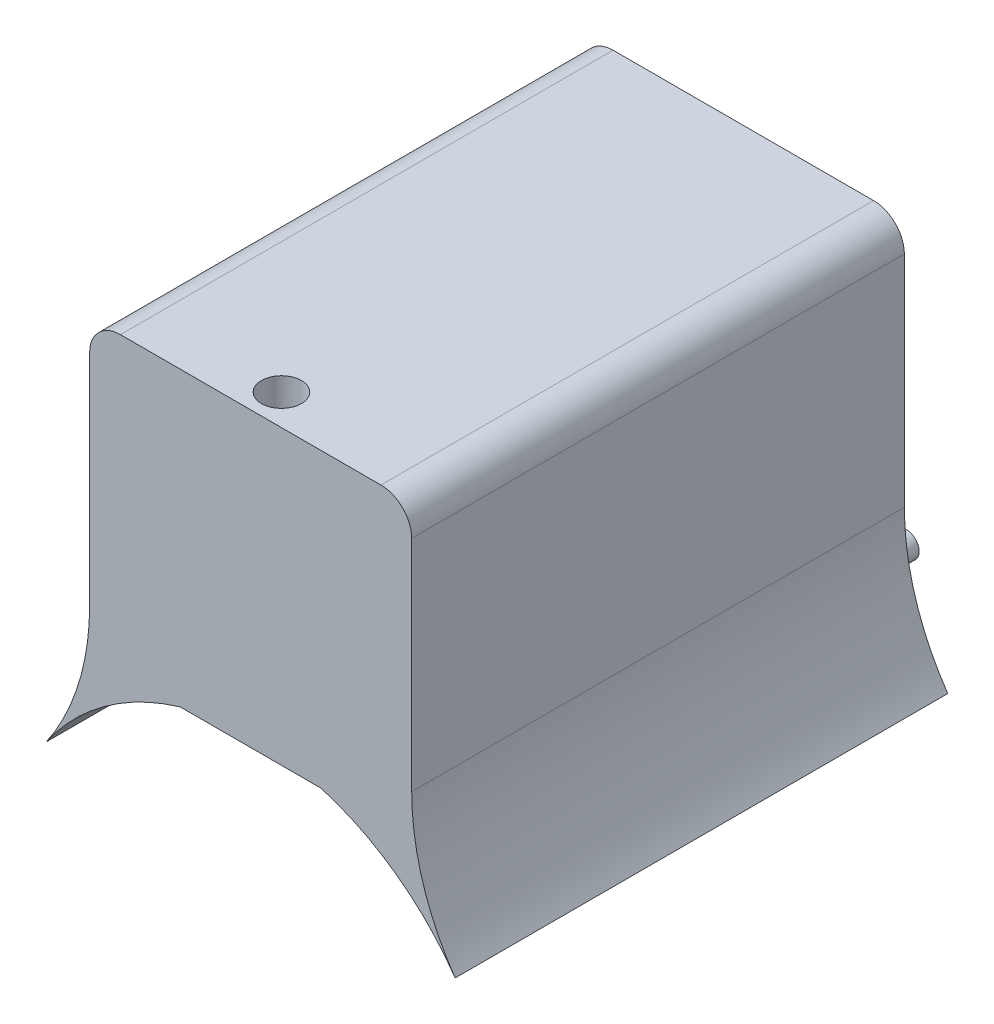
ISO-10303-21;
HEADER;
FILE_DESCRIPTION(('STEP AP214'),'2;1');
FILE_NAME('part.step','',(''),(''),'','','');
FILE_SCHEMA(('AUTOMOTIVE_DESIGN { 1 0 10303 214 1 1 1 1 }'));
ENDSEC;
DATA;
#1=APPLICATION_CONTEXT('core data for automotive mechanical design processes');
#2=APPLICATION_PROTOCOL_DEFINITION('international standard','automotive_design',2000,#1);
#3=PRODUCT_CONTEXT('',#1,'mechanical');
#4=PRODUCT('Part','Part','',(#3));
#5=PRODUCT_RELATED_PRODUCT_CATEGORY('part','',(#4));
#6=PRODUCT_DEFINITION_FORMATION('','',#4);
#7=PRODUCT_DEFINITION_CONTEXT('part definition',#1,'design');
#8=PRODUCT_DEFINITION('design','',#6,#7);
#9=PRODUCT_DEFINITION_SHAPE('','',#8);
#10=(LENGTH_UNIT() NAMED_UNIT(*) SI_UNIT(.MILLI.,.METRE.));
#11=(NAMED_UNIT(*) PLANE_ANGLE_UNIT() SI_UNIT($,.RADIAN.));
#12=(NAMED_UNIT(*) SI_UNIT($,.STERADIAN.) SOLID_ANGLE_UNIT());
#13=UNCERTAINTY_MEASURE_WITH_UNIT(LENGTH_MEASURE(1.E-05),#10,'distance_accuracy_value','');
#14=(GEOMETRIC_REPRESENTATION_CONTEXT(3) GLOBAL_UNCERTAINTY_ASSIGNED_CONTEXT((#13)) GLOBAL_UNIT_ASSIGNED_CONTEXT((#10,
#11,#12)) REPRESENTATION_CONTEXT('',''));
#15=CARTESIAN_POINT('',(0.,0.,0.));
#16=DIRECTION('',(0.,0.,1.));
#17=DIRECTION('',(1.,0.,0.));
#18=AXIS2_PLACEMENT_3D('',#15,#16,#17);
#19=CARTESIAN_POINT('',(-9.54833944562463E-13,78.6499999999996,80.));
#20=DIRECTION('',(0.,1.,0.));
#21=DIRECTION('',(-1.,0.,0.));
#22=AXIS2_PLACEMENT_3D('',#19,#20,#21);
#23=PLANE('',#22);
#24=DIRECTION('',(0.,0.,-1.));
#25=VECTOR('',#24,1.);
#26=CARTESIAN_POINT('',(-139.649999999996,78.6499999999979,80.));
#27=LINE('',#26,#25);
#28=CARTESIAN_POINT('',(-139.649999999996,78.6499999999979,65.));
#29=VERTEX_POINT('',#28);
#30=CARTESIAN_POINT('',(-139.649999999996,78.6499999999979,0.));
#31=VERTEX_POINT('',#30);
#32=EDGE_CURVE('E339',#29,#31,#27,.T.);
#33=ORIENTED_EDGE('',*,*,#32,.F.);
#34=DIRECTION('',(1.,0.,0.));
#35=VECTOR('',#34,1.);
#36=CARTESIAN_POINT('',(-9.54833944562463E-13,78.6499999999996,65.));
#37=LINE('',#36,#35);
#38=CARTESIAN_POINT('',(-137.625762394863,78.6499999999979,65.));
#39=VERTEX_POINT('',#38);
#40=EDGE_CURVE('E222',#29,#39,#37,.T.);
#41=ORIENTED_EDGE('',*,*,#40,.T.);
#42=DIRECTION('',(0.,0.,-1.));
#43=VECTOR('',#42,1.);
#44=CARTESIAN_POINT('',(-137.625762394863,78.6499999999979,80.));
#45=LINE('',#44,#43);
#46=CARTESIAN_POINT('',(-137.625762394863,78.6499999999979,0.));
#47=VERTEX_POINT('',#46);
#48=EDGE_CURVE('E64',#39,#47,#45,.T.);
#49=ORIENTED_EDGE('',*,*,#48,.T.);
#50=DIRECTION('',(1.,0.,0.));
#51=VECTOR('',#50,1.);
#52=CARTESIAN_POINT('',(-9.54833944562463E-13,78.6499999999996,0.));
#53=LINE('',#52,#51);
#54=EDGE_CURVE('E296',#31,#47,#53,.T.);
#55=ORIENTED_EDGE('',*,*,#54,.F.);
#56=EDGE_LOOP('',(#33,#41,#49,#55));
#57=FACE_BOUND('',#56,.T.);
#58=ADVANCED_FACE('F40',(#57),#23,.T.);
#59=CARTESIAN_POINT('',(-139.649999999996,80.6499999999979,80.));
#60=DIRECTION('',(0.,0.,-1.));
#61=DIRECTION('',(-1.,0.,0.));
#62=AXIS2_PLACEMENT_3D('',#59,#60,#61);
#63=CYLINDRICAL_SURFACE('',#62,2.);
#64=CARTESIAN_POINT('',(-139.649999999996,80.6499999999979,65.));
#65=DIRECTION('',(0.,0.,1.));
#66=DIRECTION('',(1.,0.,0.));
#67=AXIS2_PLACEMENT_3D('',#64,#65,#66);
#68=CIRCLE('',#67,2.);
#69=CARTESIAN_POINT('',(-141.649999999996,80.6499999999979,65.));
#70=VERTEX_POINT('',#69);
#71=EDGE_CURVE('E225',#29,#70,#68,.F.);
#72=ORIENTED_EDGE('',*,*,#71,.F.);
#73=ORIENTED_EDGE('',*,*,#32,.T.);
#74=CARTESIAN_POINT('',(-139.649999999996,80.6499999999979,0.));
#75=DIRECTION('',(0.,0.,1.));
#76=DIRECTION('',(1.,0.,0.));
#77=AXIS2_PLACEMENT_3D('',#74,#75,#76);
#78=CIRCLE('',#77,2.);
#79=CARTESIAN_POINT('',(-141.649999999996,80.6499999999979,0.));
#80=VERTEX_POINT('',#79);
#81=EDGE_CURVE('E298',#31,#80,#78,.F.);
#82=ORIENTED_EDGE('',*,*,#81,.T.);
#83=DIRECTION('',(0.,0.,-1.));
#84=VECTOR('',#83,1.);
#85=CARTESIAN_POINT('',(-141.649999999996,80.6499999999979,80.));
#86=LINE('',#85,#84);
#87=EDGE_CURVE('E337',#70,#80,#86,.T.);
#88=ORIENTED_EDGE('',*,*,#87,.F.);
#89=EDGE_LOOP('',(#72,#73,#82,#88));
#90=FACE_BOUND('',#89,.T.);
#91=ADVANCED_FACE('F426',(#90),#63,.F.);
#92=CARTESIAN_POINT('',(-141.649999999996,0.,80.));
#93=DIRECTION('',(-1.,0.,0.));
#94=DIRECTION('',(0.,0.,1.));
#95=AXIS2_PLACEMENT_3D('',#92,#93,#94);
#96=PLANE('',#95);
#97=DIRECTION('',(0.,1.,0.));
#98=VECTOR('',#97,1.);
#99=CARTESIAN_POINT('',(-141.649999999996,0.,65.));
#100=LINE('',#99,#98);
#101=CARTESIAN_POINT('',(-141.649999999996,119.949999999998,65.));
#102=VERTEX_POINT('',#101);
#103=EDGE_CURVE('E227',#70,#102,#100,.T.);
#104=ORIENTED_EDGE('',*,*,#103,.F.);
#105=ORIENTED_EDGE('',*,*,#87,.T.);
#106=DIRECTION('',(0.,1.,0.));
#107=VECTOR('',#106,1.);
#108=CARTESIAN_POINT('',(-141.649999999996,0.,0.));
#109=LINE('',#108,#107);
#110=CARTESIAN_POINT('',(-141.649999999996,119.949999999998,0.));
#111=VERTEX_POINT('',#110);
#112=EDGE_CURVE('E301',#80,#111,#109,.T.);
#113=ORIENTED_EDGE('',*,*,#112,.T.);
#114=DIRECTION('',(0.,0.,-1.));
#115=VECTOR('',#114,1.);
#116=CARTESIAN_POINT('',(-141.649999999996,119.949999999998,80.));
#117=LINE('',#116,#115);
#118=EDGE_CURVE('E335',#102,#111,#117,.T.);
#119=ORIENTED_EDGE('',*,*,#118,.F.);
#120=EDGE_LOOP('',(#104,#105,#113,#119));
#121=FACE_BOUND('',#120,.T.);
#122=ADVANCED_FACE('F420',(#121),#96,.F.);
#123=CARTESIAN_POINT('',(-139.649999999996,119.949999999998,80.));
#124=DIRECTION('',(0.,0.,-1.));
#125=DIRECTION('',(-1.,0.,0.));
#126=AXIS2_PLACEMENT_3D('',#123,#124,#125);
#127=CYLINDRICAL_SURFACE('',#126,2.);
#128=DIRECTION('',(0.,0.,-1.));
#129=VECTOR('',#128,1.);
#130=CARTESIAN_POINT('',(-139.649999999996,121.949999999998,80.));
#131=LINE('',#130,#129);
#132=CARTESIAN_POINT('',(-139.649999999996,121.949999999998,65.));
#133=VERTEX_POINT('',#132);
#134=CARTESIAN_POINT('',(-139.649999999996,121.949999999998,0.));
#135=VERTEX_POINT('',#134);
#136=EDGE_CURVE('E333',#133,#135,#131,.T.);
#137=ORIENTED_EDGE('',*,*,#136,.F.);
#138=CARTESIAN_POINT('',(-139.649999999996,119.949999999998,65.));
#139=DIRECTION('',(0.,0.,1.));
#140=DIRECTION('',(1.,0.,0.));
#141=AXIS2_PLACEMENT_3D('',#138,#139,#140);
#142=CIRCLE('',#141,2.);
#143=EDGE_CURVE('E229',#133,#102,#142,.T.);
#144=ORIENTED_EDGE('',*,*,#143,.T.);
#145=ORIENTED_EDGE('',*,*,#118,.T.);
#146=CARTESIAN_POINT('',(-139.649999999996,119.949999999998,0.));
#147=DIRECTION('',(0.,0.,1.));
#148=DIRECTION('',(1.,0.,0.));
#149=AXIS2_PLACEMENT_3D('',#146,#147,#148);
#150=CIRCLE('',#149,2.);
#151=EDGE_CURVE('E304',#135,#111,#150,.T.);
#152=ORIENTED_EDGE('',*,*,#151,.F.);
#153=EDGE_LOOP('',(#137,#144,#145,#152));
#154=FACE_BOUND('',#153,.T.);
#155=ADVANCED_FACE('F416',(#154),#127,.F.);
#156=CARTESIAN_POINT('',(0.,121.949999999998,80.));
#157=DIRECTION('',(0.,1.,0.));
#158=DIRECTION('',(0.,0.,1.));
#159=AXIS2_PLACEMENT_3D('',#156,#157,#158);
#160=PLANE('',#159);
#161=DIRECTION('',(1.,0.,0.));
#162=VECTOR('',#161,1.);
#163=CARTESIAN_POINT('',(0.,121.949999999998,65.));
#164=LINE('',#163,#162);
#165=CARTESIAN_POINT('',(-100.349999999996,121.949999999998,65.));
#166=VERTEX_POINT('',#165);
#167=EDGE_CURVE('E232',#133,#166,#164,.T.);
#168=ORIENTED_EDGE('',*,*,#167,.F.);
#169=ORIENTED_EDGE('',*,*,#136,.T.);
#170=DIRECTION('',(1.,0.,0.));
#171=VECTOR('',#170,1.);
#172=CARTESIAN_POINT('',(0.,121.949999999998,0.));
#173=LINE('',#172,#171);
#174=CARTESIAN_POINT('',(-100.349999999996,121.949999999998,0.));
#175=VERTEX_POINT('',#174);
#176=EDGE_CURVE('E307',#135,#175,#173,.T.);
#177=ORIENTED_EDGE('',*,*,#176,.T.);
#178=DIRECTION('',(0.,0.,-1.));
#179=VECTOR('',#178,1.);
#180=CARTESIAN_POINT('',(-100.349999999996,121.949999999998,80.));
#181=LINE('',#180,#179);
#182=EDGE_CURVE('E331',#166,#175,#181,.T.);
#183=ORIENTED_EDGE('',*,*,#182,.F.);
#184=EDGE_LOOP('',(#168,#169,#177,#183));
#185=FACE_BOUND('',#184,.T.);
#186=ADVANCED_FACE('F509',(#185),#160,.F.);
#187=CARTESIAN_POINT('',(-100.349999999996,119.949999999998,80.));
#188=DIRECTION('',(0.,0.,-1.));
#189=DIRECTION('',(-1.,0.,0.));
#190=AXIS2_PLACEMENT_3D('',#187,#188,#189);
#191=CYLINDRICAL_SURFACE('',#190,2.);
#192=CARTESIAN_POINT('',(-100.349999999996,119.949999999998,65.));
#193=DIRECTION('',(0.,0.,1.));
#194=DIRECTION('',(1.,0.,0.));
#195=AXIS2_PLACEMENT_3D('',#192,#193,#194);
#196=CIRCLE('',#195,2.);
#197=CARTESIAN_POINT('',(-98.3499999999964,119.949999999998,65.));
#198=VERTEX_POINT('',#197);
#199=EDGE_CURVE('E234',#166,#198,#196,.F.);
#200=ORIENTED_EDGE('',*,*,#199,.F.);
#201=ORIENTED_EDGE('',*,*,#182,.T.);
#202=CARTESIAN_POINT('',(-100.349999999996,119.949999999998,0.));
#203=DIRECTION('',(0.,0.,1.));
#204=DIRECTION('',(1.,0.,0.));
#205=AXIS2_PLACEMENT_3D('',#202,#203,#204);
#206=CIRCLE('',#205,2.);
#207=CARTESIAN_POINT('',(-98.3499999999964,119.949999999998,0.));
#208=VERTEX_POINT('',#207);
#209=EDGE_CURVE('E310',#175,#208,#206,.F.);
#210=ORIENTED_EDGE('',*,*,#209,.T.);
#211=DIRECTION('',(0.,0.,-1.));
#212=VECTOR('',#211,1.);
#213=CARTESIAN_POINT('',(-98.3499999999964,119.949999999998,80.));
#214=LINE('',#213,#212);
#215=EDGE_CURVE('E329',#198,#208,#214,.T.);
#216=ORIENTED_EDGE('',*,*,#215,.F.);
#217=EDGE_LOOP('',(#200,#201,#210,#216));
#218=FACE_BOUND('',#217,.T.);
#219=ADVANCED_FACE('F408',(#218),#191,.F.);
#220=CARTESIAN_POINT('',(-98.3499999999964,0.,80.));
#221=DIRECTION('',(1.,0.,0.));
#222=DIRECTION('',(0.,0.,-1.));
#223=AXIS2_PLACEMENT_3D('',#220,#221,#222);
#224=PLANE('',#223);
#225=DIRECTION('',(0.,-1.,0.));
#226=VECTOR('',#225,1.);
#227=CARTESIAN_POINT('',(-98.3499999999964,0.,65.));
#228=LINE('',#227,#226);
#229=CARTESIAN_POINT('',(-98.3499999999964,80.6499999999984,65.));
#230=VERTEX_POINT('',#229);
#231=EDGE_CURVE('E236',#198,#230,#228,.T.);
#232=ORIENTED_EDGE('',*,*,#231,.F.);
#233=ORIENTED_EDGE('',*,*,#215,.T.);
#234=DIRECTION('',(0.,-1.,0.));
#235=VECTOR('',#234,1.);
#236=CARTESIAN_POINT('',(-98.3499999999964,0.,0.));
#237=LINE('',#236,#235);
#238=CARTESIAN_POINT('',(-98.3499999999959,80.6499999999984,0.));
#239=VERTEX_POINT('',#238);
#240=EDGE_CURVE('E313',#208,#239,#237,.T.);
#241=ORIENTED_EDGE('',*,*,#240,.T.);
#242=DIRECTION('',(0.,0.,-1.));
#243=VECTOR('',#242,1.);
#244=CARTESIAN_POINT('',(-98.3499999999959,80.6499999999984,80.));
#245=LINE('',#244,#243);
#246=EDGE_CURVE('E327',#230,#239,#245,.T.);
#247=ORIENTED_EDGE('',*,*,#246,.F.);
#248=EDGE_LOOP('',(#232,#233,#241,#247));
#249=FACE_BOUND('',#248,.T.);
#250=ADVANCED_FACE('F404',(#249),#224,.F.);
#251=CARTESIAN_POINT('',(-100.349999999996,80.6499999999984,80.));
#252=DIRECTION('',(0.,0.,-1.));
#253=DIRECTION('',(-1.,0.,0.));
#254=AXIS2_PLACEMENT_3D('',#251,#252,#253);
#255=CYLINDRICAL_SURFACE('',#254,2.);
#256=CARTESIAN_POINT('',(-100.349999999996,80.6499999999984,65.));
#257=DIRECTION('',(0.,0.,1.));
#258=DIRECTION('',(1.,0.,0.));
#259=AXIS2_PLACEMENT_3D('',#256,#257,#258);
#260=CIRCLE('',#259,2.);
#261=CARTESIAN_POINT('',(-100.349999999996,78.6499999999984,65.));
#262=VERTEX_POINT('',#261);
#263=EDGE_CURVE('E238',#230,#262,#260,.F.);
#264=ORIENTED_EDGE('',*,*,#263,.F.);
#265=ORIENTED_EDGE('',*,*,#246,.T.);
#266=CARTESIAN_POINT('',(-100.349999999996,80.6499999999984,0.));
#267=DIRECTION('',(0.,0.,1.));
#268=DIRECTION('',(1.,0.,0.));
#269=AXIS2_PLACEMENT_3D('',#266,#267,#268);
#270=CIRCLE('',#269,2.);
#271=CARTESIAN_POINT('',(-100.349999999996,78.6499999999984,0.));
#272=VERTEX_POINT('',#271);
#273=EDGE_CURVE('E316',#239,#272,#270,.F.);
#274=ORIENTED_EDGE('',*,*,#273,.T.);
#275=DIRECTION('',(0.,0.,-1.));
#276=VECTOR('',#275,1.);
#277=CARTESIAN_POINT('',(-100.349999999996,78.6499999999984,80.));
#278=LINE('',#277,#276);
#279=EDGE_CURVE('E325',#262,#272,#278,.T.);
#280=ORIENTED_EDGE('',*,*,#279,.F.);
#281=EDGE_LOOP('',(#264,#265,#274,#280));
#282=FACE_BOUND('',#281,.T.);
#283=ADVANCED_FACE('F400',(#282),#255,.F.);
#284=CARTESIAN_POINT('',(0.,78.6499999999984,80.));
#285=DIRECTION('',(0.,-1.,0.));
#286=DIRECTION('',(0.,0.,-1.));
#287=AXIS2_PLACEMENT_3D('',#284,#285,#286);
#288=PLANE('',#287);
#289=DIRECTION('',(-1.,0.,0.));
#290=VECTOR('',#289,1.);
#291=CARTESIAN_POINT('',(0.,78.6499999999984,65.));
#292=LINE('',#291,#290);
#293=CARTESIAN_POINT('',(-102.374237605138,78.6499999999984,65.));
#294=VERTEX_POINT('',#293);
#295=EDGE_CURVE('E240',#262,#294,#292,.T.);
#296=ORIENTED_EDGE('',*,*,#295,.F.);
#297=ORIENTED_EDGE('',*,*,#279,.T.);
#298=DIRECTION('',(-1.,0.,0.));
#299=VECTOR('',#298,1.);
#300=CARTESIAN_POINT('',(0.,78.6499999999984,0.));
#301=LINE('',#300,#299);
#302=CARTESIAN_POINT('',(-102.374237605138,78.6499999999984,0.));
#303=VERTEX_POINT('',#302);
#304=EDGE_CURVE('E319',#272,#303,#301,.T.);
#305=ORIENTED_EDGE('',*,*,#304,.T.);
#306=DIRECTION('',(0.,0.,1.));
#307=VECTOR('',#306,1.);
#308=CARTESIAN_POINT('',(-102.374237605138,78.6499999999984,80.));
#309=LINE('',#308,#307);
#310=EDGE_CURVE('E360',#303,#294,#309,.T.);
#311=ORIENTED_EDGE('',*,*,#310,.T.);
#312=EDGE_LOOP('',(#296,#297,#305,#311));
#313=FACE_BOUND('',#312,.T.);
#314=ADVANCED_FACE('F393',(#313),#288,.F.);
#315=CARTESIAN_POINT('',(-102.374237605138,77.6499999999984,80.));
#316=DIRECTION('',(0.,0.,-1.));
#317=DIRECTION('',(-1.,0.,0.));
#318=AXIS2_PLACEMENT_3D('',#315,#316,#317);
#319=CYLINDRICAL_SURFACE('',#318,1.);
#320=DIRECTION('',(0.,0.,-1.));
#321=VECTOR('',#320,1.);
#322=CARTESIAN_POINT('',(-102.801011513004,76.7456416464875,80.));
#323=LINE('',#322,#321);
#324=CARTESIAN_POINT('',(-102.801011513004,76.7456416464875,65.));
#325=VERTEX_POINT('',#324);
#326=CARTESIAN_POINT('',(-102.801011513004,76.7456416464875,0.));
#327=VERTEX_POINT('',#326);
#328=EDGE_CURVE('E355',#325,#327,#323,.T.);
#329=ORIENTED_EDGE('',*,*,#328,.F.);
#330=CARTESIAN_POINT('',(-102.374237605138,77.6499999999984,65.));
#331=DIRECTION('',(0.,0.,1.));
#332=DIRECTION('',(1.,0.,0.));
#333=AXIS2_PLACEMENT_3D('',#330,#331,#332);
#334=CIRCLE('',#333,1.);
#335=EDGE_CURVE('E242',#325,#294,#334,.F.);
#336=ORIENTED_EDGE('',*,*,#335,.T.);
#337=ORIENTED_EDGE('',*,*,#310,.F.);
#338=CARTESIAN_POINT('',(-102.374237605138,77.6499999999984,0.));
#339=DIRECTION('',(0.,0.,1.));
#340=DIRECTION('',(1.,0.,0.));
#341=AXIS2_PLACEMENT_3D('',#338,#339,#340);
#342=CIRCLE('',#341,1.);
#343=EDGE_CURVE('E358',#327,#303,#342,.F.);
#344=ORIENTED_EDGE('',*,*,#343,.F.);
#345=EDGE_LOOP('',(#329,#336,#337,#344));
#346=FACE_BOUND('',#345,.T.);
#347=ADVANCED_FACE('F390',(#346),#319,.T.);
#348=CARTESIAN_POINT('',(-137.625762394863,77.6499999999979,80.));
#349=DIRECTION('',(0.,0.,-1.));
#350=DIRECTION('',(-1.,0.,0.));
#351=AXIS2_PLACEMENT_3D('',#348,#349,#350);
#352=CYLINDRICAL_SURFACE('',#351,1.);
#353=ORIENTED_EDGE('',*,*,#48,.F.);
#354=CARTESIAN_POINT('',(-137.625762394863,77.6499999999979,65.));
#355=DIRECTION('',(0.,0.,1.));
#356=DIRECTION('',(1.,0.,0.));
#357=AXIS2_PLACEMENT_3D('',#354,#355,#356);
#358=CIRCLE('',#357,1.);
#359=CARTESIAN_POINT('',(-137.198988486997,76.745641646487,65.));
#360=VERTEX_POINT('',#359);
#361=EDGE_CURVE('E12',#39,#360,#358,.F.);
#362=ORIENTED_EDGE('',*,*,#361,.T.);
#363=DIRECTION('',(0.,0.,-1.));
#364=VECTOR('',#363,1.);
#365=CARTESIAN_POINT('',(-137.198988486997,76.745641646487,80.));
#366=LINE('',#365,#364);
#367=CARTESIAN_POINT('',(-137.198988486997,76.745641646487,0.));
#368=VERTEX_POINT('',#367);
#369=EDGE_CURVE('E199',#368,#360,#366,.F.);
#370=ORIENTED_EDGE('',*,*,#369,.F.);
#371=CARTESIAN_POINT('',(-137.625762394863,77.6499999999979,0.));
#372=DIRECTION('',(0.,0.,1.));
#373=DIRECTION('',(1.,0.,0.));
#374=AXIS2_PLACEMENT_3D('',#371,#372,#373);
#375=CIRCLE('',#374,1.);
#376=EDGE_CURVE('E56',#47,#368,#375,.F.);
#377=ORIENTED_EDGE('',*,*,#376,.F.);
#378=EDGE_LOOP('',(#353,#362,#370,#377));
#379=FACE_BOUND('',#378,.T.);
#380=ADVANCED_FACE('F42',(#379),#352,.T.);
#381=CARTESIAN_POINT('',(-53.85,85.8221649309432,80.));
#382=DIRECTION('',(0.,0.,-1.));
#383=DIRECTION('',(-1.,0.,0.));
#384=AXIS2_PLACEMENT_3D('',#381,#382,#383);
#385=CYLINDRICAL_SURFACE('',#384,40.);
#386=DIRECTION('',(0.,0.,-1.));
#387=VECTOR('',#386,1.);
#388=CARTESIAN_POINT('',(-86.8014321295143,63.1461176428021,80.));
#389=LINE('',#388,#387);
#390=CARTESIAN_POINT('',(-86.8014321295143,63.1461176428021,80.));
#391=VERTEX_POINT('',#390);
#392=CARTESIAN_POINT('',(-86.8014321295143,63.1461176428021,0.));
#393=VERTEX_POINT('',#392);
#394=EDGE_CURVE('E273',#391,#393,#389,.T.);
#395=ORIENTED_EDGE('',*,*,#394,.T.);
#396=CARTESIAN_POINT('',(-53.85,85.8221649309432,0.));
#397=DIRECTION('',(0.,0.,1.));
#398=DIRECTION('',(1.,0.,0.));
#399=AXIS2_PLACEMENT_3D('',#396,#397,#398);
#400=CIRCLE('',#399,40.);
#401=CARTESIAN_POINT('',(-93.85,85.8221649309432,0.));
#402=VERTEX_POINT('',#401);
#403=EDGE_CURVE('E251',#402,#393,#400,.T.);
#404=ORIENTED_EDGE('',*,*,#403,.F.);
#405=DIRECTION('',(0.,0.,-1.));
#406=VECTOR('',#405,1.);
#407=CARTESIAN_POINT('',(-93.85,85.8221649309432,80.));
#408=LINE('',#407,#406);
#409=CARTESIAN_POINT('',(-93.85,85.8221649309432,80.));
#410=VERTEX_POINT('',#409);
#411=EDGE_CURVE('E353',#410,#402,#408,.T.);
#412=ORIENTED_EDGE('',*,*,#411,.F.);
#413=CARTESIAN_POINT('',(-53.85,85.8221649309432,80.));
#414=DIRECTION('',(0.,0.,1.));
#415=DIRECTION('',(1.,0.,0.));
#416=AXIS2_PLACEMENT_3D('',#413,#414,#415);
#417=CIRCLE('',#416,40.);
#418=EDGE_CURVE('E252',#410,#391,#417,.T.);
#419=ORIENTED_EDGE('',*,*,#418,.T.);
#420=EDGE_LOOP('',(#395,#404,#412,#419));
#421=FACE_BOUND('',#420,.T.);
#422=ADVANCED_FACE('F429',(#421),#385,.F.);
#423=CARTESIAN_POINT('',(-93.85,0.,80.));
#424=DIRECTION('',(-1.,0.,0.));
#425=DIRECTION('',(0.,0.,1.));
#426=AXIS2_PLACEMENT_3D('',#423,#424,#425);
#427=PLANE('',#426);
#428=ORIENTED_EDGE('',*,*,#411,.T.);
#429=DIRECTION('',(0.,1.,0.));
#430=VECTOR('',#429,1.);
#431=CARTESIAN_POINT('',(-93.85,0.,0.));
#432=LINE('',#431,#430);
#433=CARTESIAN_POINT('',(-93.85,121.45,0.));
#434=VERTEX_POINT('',#433);
#435=EDGE_CURVE('E276',#402,#434,#432,.T.);
#436=ORIENTED_EDGE('',*,*,#435,.T.);
#437=DIRECTION('',(0.,0.,-1.));
#438=VECTOR('',#437,1.);
#439=CARTESIAN_POINT('',(-93.85,121.45,80.));
#440=LINE('',#439,#438);
#441=CARTESIAN_POINT('',(-93.85,121.45,80.));
#442=VERTEX_POINT('',#441);
#443=EDGE_CURVE('E351',#442,#434,#440,.T.);
#444=ORIENTED_EDGE('',*,*,#443,.F.);
#445=DIRECTION('',(0.,1.,0.));
#446=VECTOR('',#445,1.);
#447=CARTESIAN_POINT('',(-93.85,0.,80.));
#448=LINE('',#447,#446);
#449=EDGE_CURVE('E255',#410,#442,#448,.T.);
#450=ORIENTED_EDGE('',*,*,#449,.F.);
#451=EDGE_LOOP('',(#428,#436,#444,#450));
#452=FACE_BOUND('',#451,.T.);
#453=ADVANCED_FACE('F434',(#452),#427,.F.);
#454=CARTESIAN_POINT('',(-98.85,121.45,80.));
#455=DIRECTION('',(0.,0.,-1.));
#456=DIRECTION('',(-1.,0.,0.));
#457=AXIS2_PLACEMENT_3D('',#454,#455,#456);
#458=CYLINDRICAL_SURFACE('',#457,5.);
#459=ORIENTED_EDGE('',*,*,#443,.T.);
#460=CARTESIAN_POINT('',(-98.85,121.45,0.));
#461=DIRECTION('',(0.,0.,1.));
#462=DIRECTION('',(1.,0.,0.));
#463=AXIS2_PLACEMENT_3D('',#460,#461,#462);
#464=CIRCLE('',#463,5.);
#465=CARTESIAN_POINT('',(-98.85,126.45,0.));
#466=VERTEX_POINT('',#465);
#467=EDGE_CURVE('E279',#434,#466,#464,.T.);
#468=ORIENTED_EDGE('',*,*,#467,.T.);
#469=DIRECTION('',(0.,0.,-1.));
#470=VECTOR('',#469,1.);
#471=CARTESIAN_POINT('',(-98.85,126.45,80.));
#472=LINE('',#471,#470);
#473=CARTESIAN_POINT('',(-98.85,126.45,80.));
#474=VERTEX_POINT('',#473);
#475=EDGE_CURVE('E349',#474,#466,#472,.T.);
#476=ORIENTED_EDGE('',*,*,#475,.F.);
#477=CARTESIAN_POINT('',(-98.85,121.45,80.));
#478=DIRECTION('',(0.,0.,1.));
#479=DIRECTION('',(1.,0.,0.));
#480=AXIS2_PLACEMENT_3D('',#477,#478,#479);
#481=CIRCLE('',#480,5.);
#482=EDGE_CURVE('E258',#442,#474,#481,.T.);
#483=ORIENTED_EDGE('',*,*,#482,.F.);
#484=EDGE_LOOP('',(#459,#468,#476,#483));
#485=FACE_BOUND('',#484,.T.);
#486=ADVANCED_FACE('F462',(#485),#458,.T.);
#487=CARTESIAN_POINT('',(0.,126.45,80.));
#488=DIRECTION('',(0.,-1.,0.));
#489=DIRECTION('',(0.,0.,-1.));
#490=AXIS2_PLACEMENT_3D('',#487,#488,#489);
#491=PLANE('',#490);
#492=CARTESIAN_POINT('',(-120.,126.45,75.));
#493=DIRECTION('',(0.,1.,0.));
#494=DIRECTION('',(0.,0.,1.));
#495=AXIS2_PLACEMENT_3D('',#492,#493,#494);
#496=CIRCLE('',#495,3.25000000000001);
#497=CARTESIAN_POINT('',(-120.,126.45,78.25));
#498=VERTEX_POINT('',#497);
#499=EDGE_CURVE('E826',#498,#498,#496,.T.);
#500=ORIENTED_EDGE('',*,*,#499,.F.);
#501=EDGE_LOOP('',(#500));
#502=FACE_BOUND('',#501,.T.);
#503=ORIENTED_EDGE('',*,*,#475,.T.);
#504=DIRECTION('',(-1.,0.,0.));
#505=VECTOR('',#504,1.);
#506=CARTESIAN_POINT('',(0.,126.45,0.));
#507=LINE('',#506,#505);
#508=CARTESIAN_POINT('',(-141.15,126.45,0.));
#509=VERTEX_POINT('',#508);
#510=EDGE_CURVE('E282',#466,#509,#507,.T.);
#511=ORIENTED_EDGE('',*,*,#510,.T.);
#512=DIRECTION('',(0.,0.,-1.));
#513=VECTOR('',#512,1.);
#514=CARTESIAN_POINT('',(-141.15,126.45,80.));
#515=LINE('',#514,#513);
#516=CARTESIAN_POINT('',(-141.15,126.45,80.));
#517=VERTEX_POINT('',#516);
#518=EDGE_CURVE('E347',#517,#509,#515,.T.);
#519=ORIENTED_EDGE('',*,*,#518,.F.);
#520=DIRECTION('',(-1.,0.,0.));
#521=VECTOR('',#520,1.);
#522=CARTESIAN_POINT('',(0.,126.45,80.));
#523=LINE('',#522,#521);
#524=EDGE_CURVE('E260',#474,#517,#523,.T.);
#525=ORIENTED_EDGE('',*,*,#524,.F.);
#526=EDGE_LOOP('',(#503,#511,#519,#525));
#527=FACE_BOUND('',#526,.T.);
#528=ADVANCED_FACE('F458',(#502,#527),#491,.F.);
#529=CARTESIAN_POINT('',(-141.15,121.45,80.));
#530=DIRECTION('',(0.,0.,-1.));
#531=DIRECTION('',(-1.,0.,0.));
#532=AXIS2_PLACEMENT_3D('',#529,#530,#531);
#533=CYLINDRICAL_SURFACE('',#532,5.);
#534=ORIENTED_EDGE('',*,*,#518,.T.);
#535=CARTESIAN_POINT('',(-141.15,121.45,0.));
#536=DIRECTION('',(0.,0.,1.));
#537=DIRECTION('',(1.,0.,0.));
#538=AXIS2_PLACEMENT_3D('',#535,#536,#537);
#539=CIRCLE('',#538,5.);
#540=CARTESIAN_POINT('',(-146.15,121.45,0.));
#541=VERTEX_POINT('',#540);
#542=EDGE_CURVE('E285',#509,#541,#539,.T.);
#543=ORIENTED_EDGE('',*,*,#542,.T.);
#544=DIRECTION('',(0.,0.,-1.));
#545=VECTOR('',#544,1.);
#546=CARTESIAN_POINT('',(-146.15,121.45,80.));
#547=LINE('',#546,#545);
#548=CARTESIAN_POINT('',(-146.15,121.45,80.));
#549=VERTEX_POINT('',#548);
#550=EDGE_CURVE('E345',#549,#541,#547,.T.);
#551=ORIENTED_EDGE('',*,*,#550,.F.);
#552=CARTESIAN_POINT('',(-141.15,121.45,80.));
#553=DIRECTION('',(0.,0.,1.));
#554=DIRECTION('',(1.,0.,0.));
#555=AXIS2_PLACEMENT_3D('',#552,#553,#554);
#556=CIRCLE('',#555,5.);
#557=EDGE_CURVE('E262',#517,#549,#556,.T.);
#558=ORIENTED_EDGE('',*,*,#557,.F.);
#559=EDGE_LOOP('',(#534,#543,#551,#558));
#560=FACE_BOUND('',#559,.T.);
#561=ADVANCED_FACE('F454',(#560),#533,.T.);
#562=CARTESIAN_POINT('',(-146.15,0.,80.));
#563=DIRECTION('',(1.,0.,0.));
#564=DIRECTION('',(0.,0.,-1.));
#565=AXIS2_PLACEMENT_3D('',#562,#563,#564);
#566=PLANE('',#565);
#567=ORIENTED_EDGE('',*,*,#550,.T.);
#568=DIRECTION('',(0.,-1.,0.));
#569=VECTOR('',#568,1.);
#570=CARTESIAN_POINT('',(-146.15,0.,0.));
#571=LINE('',#570,#569);
#572=CARTESIAN_POINT('',(-146.15,85.8221649309432,0.));
#573=VERTEX_POINT('',#572);
#574=EDGE_CURVE('E288',#541,#573,#571,.T.);
#575=ORIENTED_EDGE('',*,*,#574,.T.);
#576=DIRECTION('',(0.,0.,-1.));
#577=VECTOR('',#576,1.);
#578=CARTESIAN_POINT('',(-146.15,85.8221649309432,80.));
#579=LINE('',#578,#577);
#580=CARTESIAN_POINT('',(-146.15,85.8221649309432,80.));
#581=VERTEX_POINT('',#580);
#582=EDGE_CURVE('E343',#581,#573,#579,.T.);
#583=ORIENTED_EDGE('',*,*,#582,.F.);
#584=DIRECTION('',(0.,-1.,0.));
#585=VECTOR('',#584,1.);
#586=CARTESIAN_POINT('',(-146.15,0.,80.));
#587=LINE('',#586,#585);
#588=EDGE_CURVE('E264',#549,#581,#587,.T.);
#589=ORIENTED_EDGE('',*,*,#588,.F.);
#590=EDGE_LOOP('',(#567,#575,#583,#589));
#591=FACE_BOUND('',#590,.T.);
#592=ADVANCED_FACE('F450',(#591),#566,.F.);
#593=CARTESIAN_POINT('',(-186.15,85.8221649309432,80.));
#594=DIRECTION('',(0.,0.,-1.));
#595=DIRECTION('',(-1.,0.,0.));
#596=AXIS2_PLACEMENT_3D('',#593,#594,#595);
#597=CYLINDRICAL_SURFACE('',#596,40.);
#598=ORIENTED_EDGE('',*,*,#582,.T.);
#599=CARTESIAN_POINT('',(-186.15,85.8221649309432,0.));
#600=DIRECTION('',(0.,0.,1.));
#601=DIRECTION('',(1.,0.,0.));
#602=AXIS2_PLACEMENT_3D('',#599,#600,#601);
#603=CIRCLE('',#602,40.);
#604=CARTESIAN_POINT('',(-153.198567870486,63.1461176428021,0.));
#605=VERTEX_POINT('',#604);
#606=EDGE_CURVE('E291',#605,#573,#603,.T.);
#607=ORIENTED_EDGE('',*,*,#606,.F.);
#608=DIRECTION('',(0.,0.,-1.));
#609=VECTOR('',#608,1.);
#610=CARTESIAN_POINT('',(-153.198567870486,63.1461176428021,80.));
#611=LINE('',#610,#609);
#612=CARTESIAN_POINT('',(-153.198567870486,63.1461176428021,80.));
#613=VERTEX_POINT('',#612);
#614=EDGE_CURVE('E341',#613,#605,#611,.T.);
#615=ORIENTED_EDGE('',*,*,#614,.F.);
#616=CARTESIAN_POINT('',(-186.15,85.8221649309432,80.));
#617=DIRECTION('',(0.,0.,1.));
#618=DIRECTION('',(1.,0.,0.));
#619=AXIS2_PLACEMENT_3D('',#616,#617,#618);
#620=CIRCLE('',#619,40.);
#621=EDGE_CURVE('E266',#613,#581,#620,.T.);
#622=ORIENTED_EDGE('',*,*,#621,.T.);
#623=EDGE_LOOP('',(#598,#607,#615,#622));
#624=FACE_BOUND('',#623,.T.);
#625=ADVANCED_FACE('F447',(#624),#597,.F.);
#626=CARTESIAN_POINT('',(-120.,40.3,80.));
#627=DIRECTION('',(0.,0.,-1.));
#628=DIRECTION('',(-1.,0.,0.));
#629=AXIS2_PLACEMENT_3D('',#626,#627,#628);
#630=CYLINDRICAL_SURFACE('',#629,40.3);
#631=ORIENTED_EDGE('',*,*,#614,.T.);
#632=CARTESIAN_POINT('',(-120.,40.3,0.));
#633=DIRECTION('',(0.,0.,1.));
#634=DIRECTION('',(1.,0.,0.));
#635=AXIS2_PLACEMENT_3D('',#632,#633,#634);
#636=CIRCLE('',#635,40.3);
#637=EDGE_CURVE('E294',#368,#605,#636,.T.);
#638=ORIENTED_EDGE('',*,*,#637,.F.);
#639=ORIENTED_EDGE('',*,*,#369,.T.);
#640=CARTESIAN_POINT('',(-120.,40.3,65.));
#641=DIRECTION('',(0.,0.,-1.));
#642=DIRECTION('',(1.,0.,0.));
#643=AXIS2_PLACEMENT_3D('',#640,#641,#642);
#644=CIRCLE('',#643,40.3);
#645=CARTESIAN_POINT('',(-131.413478873683,78.95,65.));
#646=VERTEX_POINT('',#645);
#647=EDGE_CURVE('E193',#360,#646,#644,.T.);
#648=ORIENTED_EDGE('',*,*,#647,.T.);
#649=DIRECTION('',(0.,0.,1.));
#650=VECTOR('',#649,1.);
#651=CARTESIAN_POINT('',(-131.413478873683,78.95,65.));
#652=LINE('',#651,#650);
#653=CARTESIAN_POINT('',(-131.413478873683,78.95,80.));
#654=VERTEX_POINT('',#653);
#655=EDGE_CURVE('E196',#646,#654,#652,.T.);
#656=ORIENTED_EDGE('',*,*,#655,.T.);
#657=CARTESIAN_POINT('',(-120.,40.3,80.));
#658=DIRECTION('',(0.,0.,1.));
#659=DIRECTION('',(1.,0.,0.));
#660=AXIS2_PLACEMENT_3D('',#657,#658,#659);
#661=CIRCLE('',#660,40.3);
#662=EDGE_CURVE('E269',#654,#613,#661,.T.);
#663=ORIENTED_EDGE('',*,*,#662,.T.);
#664=EDGE_LOOP('',(#631,#638,#639,#648,#656,#663));
#665=FACE_BOUND('',#664,.T.);
#666=ADVANCED_FACE('F195',(#665),#630,.F.);
#667=CARTESIAN_POINT('',(-120.,40.3,80.));
#668=DIRECTION('',(0.,0.,-1.));
#669=DIRECTION('',(-1.,0.,0.));
#670=AXIS2_PLACEMENT_3D('',#667,#668,#669);
#671=CYLINDRICAL_SURFACE('',#670,40.3);
#672=CARTESIAN_POINT('',(-120.,40.3,65.));
#673=DIRECTION('',(0.,0.,-1.));
#674=DIRECTION('',(1.,0.,0.));
#675=AXIS2_PLACEMENT_3D('',#672,#673,#674);
#676=CIRCLE('',#675,40.3);
#677=CARTESIAN_POINT('',(-108.586521126317,78.95,65.));
#678=VERTEX_POINT('',#677);
#679=EDGE_CURVE('E212',#678,#325,#676,.T.);
#680=ORIENTED_EDGE('',*,*,#679,.T.);
#681=ORIENTED_EDGE('',*,*,#328,.T.);
#682=CARTESIAN_POINT('',(-120.,40.3,0.));
#683=DIRECTION('',(0.,0.,1.));
#684=DIRECTION('',(1.,0.,0.));
#685=AXIS2_PLACEMENT_3D('',#682,#683,#684);
#686=CIRCLE('',#685,40.3);
#687=EDGE_CURVE('E256',#393,#327,#686,.T.);
#688=ORIENTED_EDGE('',*,*,#687,.F.);
#689=ORIENTED_EDGE('',*,*,#394,.F.);
#690=CARTESIAN_POINT('',(-120.,40.3,80.));
#691=DIRECTION('',(0.,0.,1.));
#692=DIRECTION('',(1.,0.,0.));
#693=AXIS2_PLACEMENT_3D('',#690,#691,#692);
#694=CIRCLE('',#693,40.3);
#695=CARTESIAN_POINT('',(-108.586521126317,78.95,80.));
#696=VERTEX_POINT('',#695);
#697=EDGE_CURVE('E271',#391,#696,#694,.T.);
#698=ORIENTED_EDGE('',*,*,#697,.T.);
#699=DIRECTION('',(0.,0.,1.));
#700=VECTOR('',#699,1.);
#701=CARTESIAN_POINT('',(-108.586521126317,78.95,65.));
#702=LINE('',#701,#700);
#703=EDGE_CURVE('E211',#678,#696,#702,.T.);
#704=ORIENTED_EDGE('',*,*,#703,.F.);
#705=EDGE_LOOP('',(#680,#681,#688,#689,#698,#704));
#706=FACE_BOUND('',#705,.T.);
#707=ADVANCED_FACE('F386',(#706),#671,.F.);
#708=CARTESIAN_POINT('',(0.,0.,80.));
#709=DIRECTION('',(0.,0.,1.));
#710=DIRECTION('',(1.,0.,0.));
#711=AXIS2_PLACEMENT_3D('',#708,#709,#710);
#712=PLANE('',#711);
#713=DIRECTION('',(1.,0.,0.));
#714=VECTOR('',#713,1.);
#715=CARTESIAN_POINT('',(-131.413478873683,78.95,80.));
#716=LINE('',#715,#714);
#717=EDGE_CURVE('E203',#654,#696,#716,.T.);
#718=ORIENTED_EDGE('',*,*,#717,.T.);
#719=ORIENTED_EDGE('',*,*,#697,.F.);
#720=ORIENTED_EDGE('',*,*,#418,.F.);
#721=ORIENTED_EDGE('',*,*,#449,.T.);
#722=ORIENTED_EDGE('',*,*,#482,.T.);
#723=ORIENTED_EDGE('',*,*,#524,.T.);
#724=ORIENTED_EDGE('',*,*,#557,.T.);
#725=ORIENTED_EDGE('',*,*,#588,.T.);
#726=ORIENTED_EDGE('',*,*,#621,.F.);
#727=ORIENTED_EDGE('',*,*,#662,.F.);
#728=EDGE_LOOP('',(#718,#719,#720,#721,#722,#723,#724,#725,#726,#727));
#729=FACE_BOUND('',#728,.T.);
#730=ADVANCED_FACE('F377',(#729),#712,.T.);
#731=CARTESIAN_POINT('',(0.,0.,0.));
#732=DIRECTION('',(0.,0.,1.));
#733=DIRECTION('',(1.,0.,0.));
#734=AXIS2_PLACEMENT_3D('',#731,#732,#733);
#735=PLANE('',#734);
#736=CARTESIAN_POINT('',(-97.,77.3,0.));
#737=DIRECTION('',(0.,0.,1.));
#738=DIRECTION('',(1.,0.,0.));
#739=AXIS2_PLACEMENT_3D('',#736,#737,#738);
#740=CIRCLE('',#739,2.04999999999999);
#741=CARTESIAN_POINT('',(-94.95,77.3,0.));
#742=VERTEX_POINT('',#741);
#743=EDGE_CURVE('E49',#742,#742,#740,.F.);
#744=ORIENTED_EDGE('',*,*,#743,.F.);
#745=EDGE_LOOP('',(#744));
#746=FACE_BOUND('',#745,.T.);
#747=CARTESIAN_POINT('',(-143.,77.3,0.));
#748=DIRECTION('',(0.,0.,1.));
#749=DIRECTION('',(1.,0.,0.));
#750=AXIS2_PLACEMENT_3D('',#747,#748,#749);
#751=CIRCLE('',#750,2.04999999999999);
#752=CARTESIAN_POINT('',(-140.95,77.3,0.));
#753=VERTEX_POINT('',#752);
#754=EDGE_CURVE('E365',#753,#753,#751,.F.);
#755=ORIENTED_EDGE('',*,*,#754,.F.);
#756=EDGE_LOOP('',(#755));
#757=FACE_BOUND('',#756,.T.);
#758=ORIENTED_EDGE('',*,*,#687,.T.);
#759=ORIENTED_EDGE('',*,*,#343,.T.);
#760=ORIENTED_EDGE('',*,*,#304,.F.);
#761=ORIENTED_EDGE('',*,*,#273,.F.);
#762=ORIENTED_EDGE('',*,*,#240,.F.);
#763=ORIENTED_EDGE('',*,*,#209,.F.);
#764=ORIENTED_EDGE('',*,*,#176,.F.);
#765=ORIENTED_EDGE('',*,*,#151,.T.);
#766=ORIENTED_EDGE('',*,*,#112,.F.);
#767=ORIENTED_EDGE('',*,*,#81,.F.);
#768=ORIENTED_EDGE('',*,*,#54,.T.);
#769=ORIENTED_EDGE('',*,*,#376,.T.);
#770=ORIENTED_EDGE('',*,*,#637,.T.);
#771=ORIENTED_EDGE('',*,*,#606,.T.);
#772=ORIENTED_EDGE('',*,*,#574,.F.);
#773=ORIENTED_EDGE('',*,*,#542,.F.);
#774=ORIENTED_EDGE('',*,*,#510,.F.);
#775=ORIENTED_EDGE('',*,*,#467,.F.);
#776=ORIENTED_EDGE('',*,*,#435,.F.);
#777=ORIENTED_EDGE('',*,*,#403,.T.);
#778=EDGE_LOOP('',(#758,#759,#760,#761,#762,#763,#764,#765,#766,#767,#768,#769,#770,#771,#772,
#773,#774,#775,#776,#777));
#779=FACE_BOUND('',#778,.T.);
#780=ADVANCED_FACE('F373',(#746,#757,#779),#735,.F.);
#781=CARTESIAN_POINT('',(-143.,77.3,-3.5));
#782=DIRECTION('',(0.,0.,1.));
#783=DIRECTION('',(1.,0.,0.));
#784=AXIS2_PLACEMENT_3D('',#781,#782,#783);
#785=CYLINDRICAL_SURFACE('',#784,2.04999999999999);
#786=CARTESIAN_POINT('',(-143.,77.3,-3.5));
#787=DIRECTION('',(0.,0.,-1.));
#788=DIRECTION('',(-1.,0.,0.));
#789=AXIS2_PLACEMENT_3D('',#786,#787,#788);
#790=CIRCLE('',#789,2.04999999999999);
#791=CARTESIAN_POINT('',(-145.05,77.3,-3.5));
#792=VERTEX_POINT('',#791);
#793=EDGE_CURVE('E248',#792,#792,#790,.T.);
#794=ORIENTED_EDGE('',*,*,#793,.F.);
#795=EDGE_LOOP('',(#794));
#796=FACE_BOUND('',#795,.T.);
#797=ORIENTED_EDGE('',*,*,#754,.T.);
#798=EDGE_LOOP('',(#797));
#799=FACE_BOUND('',#798,.T.);
#800=ADVANCED_FACE('F376',(#796,#799),#785,.T.);
#801=CARTESIAN_POINT('',(-143.,77.3,-3.5));
#802=DIRECTION('',(0.,0.,-1.));
#803=DIRECTION('',(-1.,0.,0.));
#804=AXIS2_PLACEMENT_3D('',#801,#802,#803);
#805=PLANE('',#804);
#806=ORIENTED_EDGE('',*,*,#793,.T.);
#807=EDGE_LOOP('',(#806));
#808=FACE_BOUND('',#807,.T.);
#809=ADVANCED_FACE('F746',(#808),#805,.T.);
#810=CARTESIAN_POINT('',(-97.,77.3,-3.5));
#811=DIRECTION('',(0.,0.,1.));
#812=DIRECTION('',(1.,0.,0.));
#813=AXIS2_PLACEMENT_3D('',#810,#811,#812);
#814=CYLINDRICAL_SURFACE('',#813,2.04999999999999);
#815=CARTESIAN_POINT('',(-97.,77.3,-3.5));
#816=DIRECTION('',(0.,0.,-1.));
#817=DIRECTION('',(-1.,0.,0.));
#818=AXIS2_PLACEMENT_3D('',#815,#816,#817);
#819=CIRCLE('',#818,2.04999999999999);
#820=CARTESIAN_POINT('',(-99.05,77.3,-3.5));
#821=VERTEX_POINT('',#820);
#822=EDGE_CURVE('E245',#821,#821,#819,.T.);
#823=ORIENTED_EDGE('',*,*,#822,.F.);
#824=EDGE_LOOP('',(#823));
#825=FACE_BOUND('',#824,.T.);
#826=ORIENTED_EDGE('',*,*,#743,.T.);
#827=EDGE_LOOP('',(#826));
#828=FACE_BOUND('',#827,.T.);
#829=ADVANCED_FACE('F371',(#825,#828),#814,.T.);
#830=CARTESIAN_POINT('',(-97.,77.3,-3.5));
#831=DIRECTION('',(0.,0.,-1.));
#832=DIRECTION('',(-1.,0.,0.));
#833=AXIS2_PLACEMENT_3D('',#830,#831,#832);
#834=PLANE('',#833);
#835=ORIENTED_EDGE('',*,*,#822,.T.);
#836=EDGE_LOOP('',(#835));
#837=FACE_BOUND('',#836,.T.);
#838=ADVANCED_FACE('F650',(#837),#834,.T.);
#839=CARTESIAN_POINT('',(-131.413478873683,78.95,65.));
#840=DIRECTION('',(0.,-1.,0.));
#841=DIRECTION('',(0.,0.,-1.));
#842=AXIS2_PLACEMENT_3D('',#839,#840,#841);
#843=PLANE('',#842);
#844=CARTESIAN_POINT('',(-120.,78.95,75.));
#845=DIRECTION('',(0.,-1.,0.));
#846=DIRECTION('',(0.,0.,-1.));
#847=AXIS2_PLACEMENT_3D('',#844,#845,#846);
#848=CIRCLE('',#847,1.65);
#849=CARTESIAN_POINT('',(-120.,78.95,73.35));
#850=VERTEX_POINT('',#849);
#851=EDGE_CURVE('E44',#850,#850,#848,.T.);
#852=ORIENTED_EDGE('',*,*,#851,.F.);
#853=EDGE_LOOP('',(#852));
#854=FACE_BOUND('',#853,.T.);
#855=ORIENTED_EDGE('',*,*,#717,.F.);
#856=ORIENTED_EDGE('',*,*,#655,.F.);
#857=DIRECTION('',(1.,0.,0.));
#858=VECTOR('',#857,1.);
#859=CARTESIAN_POINT('',(-131.413478873683,78.95,65.));
#860=LINE('',#859,#858);
#861=EDGE_CURVE('E202',#646,#678,#860,.T.);
#862=ORIENTED_EDGE('',*,*,#861,.T.);
#863=ORIENTED_EDGE('',*,*,#703,.T.);
#864=EDGE_LOOP('',(#855,#856,#862,#863));
#865=FACE_BOUND('',#864,.T.);
#866=ADVANCED_FACE('F207',(#854,#865),#843,.T.);
#867=CARTESIAN_POINT('',(-53.85,85.8221649309432,65.));
#868=DIRECTION('',(0.,0.,1.));
#869=DIRECTION('',(1.,0.,0.));
#870=AXIS2_PLACEMENT_3D('',#867,#868,#869);
#871=PLANE('',#870);
#872=ORIENTED_EDGE('',*,*,#335,.F.);
#873=ORIENTED_EDGE('',*,*,#679,.F.);
#874=ORIENTED_EDGE('',*,*,#861,.F.);
#875=ORIENTED_EDGE('',*,*,#647,.F.);
#876=ORIENTED_EDGE('',*,*,#361,.F.);
#877=ORIENTED_EDGE('',*,*,#40,.F.);
#878=ORIENTED_EDGE('',*,*,#71,.T.);
#879=ORIENTED_EDGE('',*,*,#103,.T.);
#880=ORIENTED_EDGE('',*,*,#143,.F.);
#881=ORIENTED_EDGE('',*,*,#167,.T.);
#882=ORIENTED_EDGE('',*,*,#199,.T.);
#883=ORIENTED_EDGE('',*,*,#231,.T.);
#884=ORIENTED_EDGE('',*,*,#263,.T.);
#885=ORIENTED_EDGE('',*,*,#295,.T.);
#886=EDGE_LOOP('',(#872,#873,#874,#875,#876,#877,#878,#879,#880,#881,#882,#883,#884,#885));
#887=FACE_BOUND('',#886,.T.);
#888=ADVANCED_FACE('F214',(#887),#871,.F.);
#889=CARTESIAN_POINT('',(-131.413478873683,81.95,65.));
#890=DIRECTION('',(0.,-1.,0.));
#891=DIRECTION('',(0.,0.,-1.));
#892=AXIS2_PLACEMENT_3D('',#889,#890,#891);
#893=PLANE('',#892);
#894=CARTESIAN_POINT('',(-120.,81.95,75.));
#895=DIRECTION('',(0.,1.,0.));
#896=DIRECTION('',(0.,0.,1.));
#897=AXIS2_PLACEMENT_3D('',#894,#895,#896);
#898=CIRCLE('',#897,1.65);
#899=CARTESIAN_POINT('',(-120.,81.95,76.65));
#900=VERTEX_POINT('',#899);
#901=EDGE_CURVE('E824',#900,#900,#898,.T.);
#902=ORIENTED_EDGE('',*,*,#901,.F.);
#903=EDGE_LOOP('',(#902));
#904=FACE_BOUND('',#903,.T.);
#905=CARTESIAN_POINT('',(-120.,81.95,75.));
#906=DIRECTION('',(0.,-1.,0.));
#907=DIRECTION('',(0.,0.,-1.));
#908=AXIS2_PLACEMENT_3D('',#905,#906,#907);
#909=CIRCLE('',#908,3.25000000000001);
#910=CARTESIAN_POINT('',(-120.,81.95,71.75));
#911=VERTEX_POINT('',#910);
#912=EDGE_CURVE('E221',#911,#911,#909,.F.);
#913=ORIENTED_EDGE('',*,*,#912,.T.);
#914=EDGE_LOOP('',(#913));
#915=FACE_BOUND('',#914,.T.);
#916=ADVANCED_FACE('F622',(#904,#915),#893,.F.);
#917=CARTESIAN_POINT('',(-120.,69.7576118445749,75.));
#918=DIRECTION('',(0.,1.,0.));
#919=DIRECTION('',(0.,0.,1.));
#920=AXIS2_PLACEMENT_3D('',#917,#918,#919);
#921=CYLINDRICAL_SURFACE('',#920,3.25000000000001);
#922=ORIENTED_EDGE('',*,*,#499,.T.);
#923=EDGE_LOOP('',(#922));
#924=FACE_BOUND('',#923,.T.);
#925=ORIENTED_EDGE('',*,*,#912,.F.);
#926=EDGE_LOOP('',(#925));
#927=FACE_BOUND('',#926,.T.);
#928=ADVANCED_FACE('F634',(#924,#927),#921,.F.);
#929=CARTESIAN_POINT('',(-120.,63.1461176428021,75.));
#930=DIRECTION('',(0.,1.,0.));
#931=DIRECTION('',(0.,0.,1.));
#932=AXIS2_PLACEMENT_3D('',#929,#930,#931);
#933=CYLINDRICAL_SURFACE('',#932,1.65);
#934=ORIENTED_EDGE('',*,*,#851,.T.);
#935=EDGE_LOOP('',(#934));
#936=FACE_BOUND('',#935,.T.);
#937=ORIENTED_EDGE('',*,*,#901,.T.);
#938=EDGE_LOOP('',(#937));
#939=FACE_BOUND('',#938,.T.);
#940=ADVANCED_FACE('F639',(#936,#939),#933,.F.);
#941=CLOSED_SHELL('',(#58,#91,#122,#155,#186,#219,#250,#283,#314,#347,#380,#422,#453,#486,#528,
#561,#592,#625,#666,#707,#730,#780,#800,#809,#829,#838,#866,#888,#916,#928,#940));
#942=MANIFOLD_SOLID_BREP('B2',#941);
#943=ADVANCED_BREP_SHAPE_REPRESENTATION('',(#18,#942),#14);
#944=SHAPE_DEFINITION_REPRESENTATION(#9,#943);
ENDSEC;
END-ISO-10303-21;
